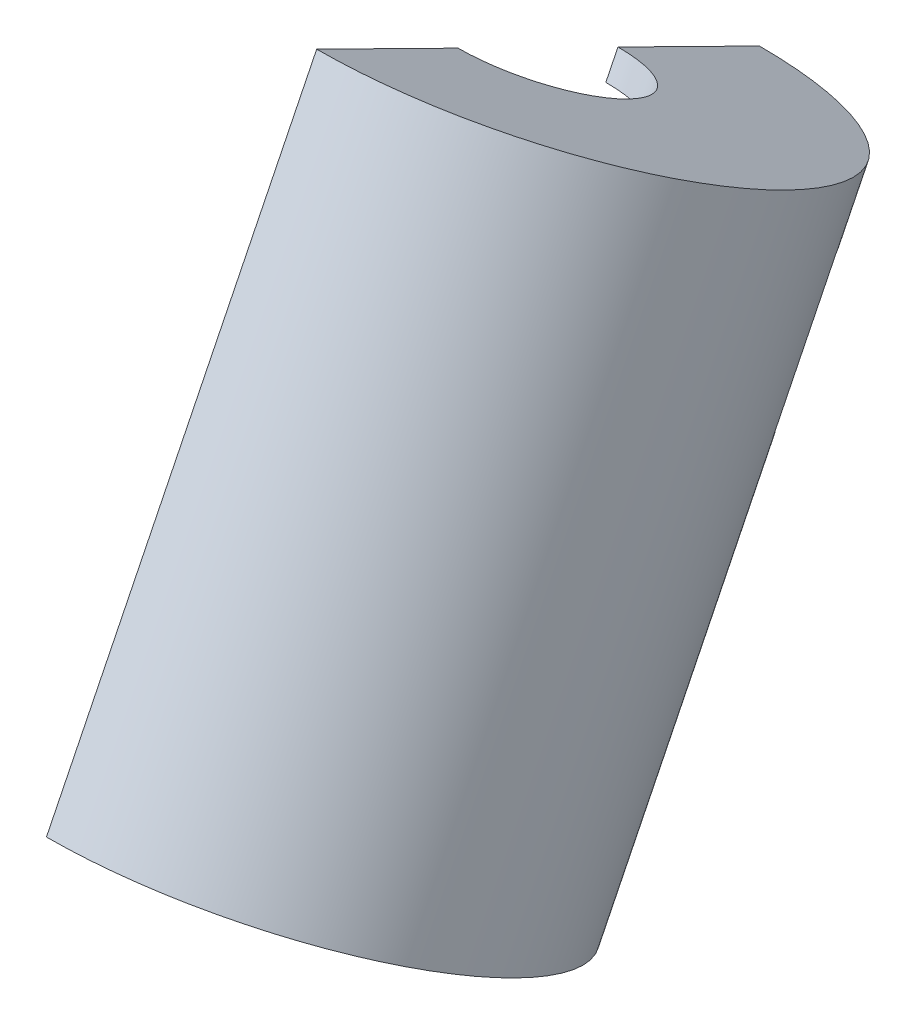
ISO-10303-21;
HEADER;
FILE_DESCRIPTION(('STEP AP214'),'2;1');
FILE_NAME('part.step','',(''),(''),'','','');
FILE_SCHEMA(('AUTOMOTIVE_DESIGN { 1 0 10303 214 1 1 1 1 }'));
ENDSEC;
DATA;
#1=APPLICATION_CONTEXT('core data for automotive mechanical design processes');
#2=APPLICATION_PROTOCOL_DEFINITION('international standard','automotive_design',2000,#1);
#3=PRODUCT_CONTEXT('',#1,'mechanical');
#4=PRODUCT('Part','Part','',(#3));
#5=PRODUCT_RELATED_PRODUCT_CATEGORY('part','',(#4));
#6=PRODUCT_DEFINITION_FORMATION('','',#4);
#7=PRODUCT_DEFINITION_CONTEXT('part definition',#1,'design');
#8=PRODUCT_DEFINITION('design','',#6,#7);
#9=PRODUCT_DEFINITION_SHAPE('','',#8);
#10=(LENGTH_UNIT() NAMED_UNIT(*) SI_UNIT(.MILLI.,.METRE.));
#11=(NAMED_UNIT(*) PLANE_ANGLE_UNIT() SI_UNIT($,.RADIAN.));
#12=(NAMED_UNIT(*) SI_UNIT($,.STERADIAN.) SOLID_ANGLE_UNIT());
#13=UNCERTAINTY_MEASURE_WITH_UNIT(LENGTH_MEASURE(1.E-05),#10,'distance_accuracy_value','');
#14=(GEOMETRIC_REPRESENTATION_CONTEXT(3) GLOBAL_UNCERTAINTY_ASSIGNED_CONTEXT((#13)) GLOBAL_UNIT_ASSIGNED_CONTEXT((#10,
#11,#12)) REPRESENTATION_CONTEXT('',''));
#15=CARTESIAN_POINT('',(0.,0.,0.));
#16=DIRECTION('',(0.,0.,1.));
#17=DIRECTION('',(1.,0.,0.));
#18=AXIS2_PLACEMENT_3D('',#15,#16,#17);
#19=CARTESIAN_POINT('',(-3.,84.7878650832363,123.186140226396));
#20=DIRECTION('',(0.,0.442780312456279,0.896630132719797));
#21=DIRECTION('',(0.,0.896630132719797,-0.442780312456279));
#22=AXIS2_PLACEMENT_3D('',#19,#20,#21);
#23=PLANE('',#22);
#24=DIRECTION('',(0.,0.896630132719797,-0.442780312456279));
#25=VECTOR('',#24,1.);
#26=CARTESIAN_POINT('',(-32.8,59.682221367082,135.583988975171));
#27=LINE('',#26,#25);
#28=CARTESIAN_POINT('',(-32.8,83.8912349505166,123.628920538852));
#29=VERTEX_POINT('',#28);
#30=CARTESIAN_POINT('',(-32.8,93.3058513440744,118.979727258061));
#31=VERTEX_POINT('',#30);
#32=EDGE_CURVE('E525',#29,#31,#27,.T.);
#33=ORIENTED_EDGE('',*,*,#32,.T.);
#34=DIRECTION('',(-1.,0.,0.));
#35=VECTOR('',#34,1.);
#36=CARTESIAN_POINT('',(-3.00000000000004,93.3058513440744,118.979727258061));
#37=LINE('',#36,#35);
#38=CARTESIAN_POINT('',(-28.0333704529043,93.3058513440744,118.979727258061));
#39=VERTEX_POINT('',#38);
#40=EDGE_CURVE('E199',#31,#39,#37,.F.);
#41=ORIENTED_EDGE('',*,*,#40,.T.);
#42=DIRECTION('',(0.,-0.896630132719797,0.442780312456279));
#43=VECTOR('',#42,1.);
#44=CARTESIAN_POINT('',(-28.0333704529043,97.7890020076734,116.76582569578));
#45=LINE('',#44,#43);
#46=CARTESIAN_POINT('',(-28.0333704529043,83.8912349505166,123.628920538852));
#47=VERTEX_POINT('',#46);
#48=EDGE_CURVE('E11',#47,#39,#45,.F.);
#49=ORIENTED_EDGE('',*,*,#48,.F.);
#50=DIRECTION('',(-1.,0.,0.));
#51=VECTOR('',#50,1.);
#52=CARTESIAN_POINT('',(-3.,83.8912349505166,123.628920538852));
#53=LINE('',#52,#51);
#54=EDGE_CURVE('E205',#29,#47,#53,.F.);
#55=ORIENTED_EDGE('',*,*,#54,.F.);
#56=EDGE_LOOP('',(#33,#41,#49,#55));
#57=FACE_BOUND('',#56,.T.);
#58=ADVANCED_FACE('F17',(#57),#23,.F.);
#59=CARTESIAN_POINT('',(-43.,59.682221367082,135.583988975171));
#60=DIRECTION('',(0.,0.442780312456279,0.896630132719797));
#61=DIRECTION('',(0.,0.896630132719797,-0.442780312456279));
#62=AXIS2_PLACEMENT_3D('',#59,#60,#61);
#63=PLANE('',#62);
#64=DIRECTION('',(1.,0.,0.));
#65=VECTOR('',#64,1.);
#66=CARTESIAN_POINT('',(-43.,95.9957417422338,117.651386320692));
#67=LINE('',#66,#65);
#68=CARTESIAN_POINT('',(-32.8,95.9957417422338,117.651386320692));
#69=VERTEX_POINT('',#68);
#70=CARTESIAN_POINT('',(-43.,95.9957417422338,117.651386320692));
#71=VERTEX_POINT('',#70);
#72=EDGE_CURVE('E160',#69,#71,#67,.F.);
#73=ORIENTED_EDGE('',*,*,#72,.T.);
#74=DIRECTION('',(0.,0.896630132719797,-0.442780312456279));
#75=VECTOR('',#74,1.);
#76=CARTESIAN_POINT('',(-43.,59.682221367082,135.583988975171));
#77=LINE('',#76,#75);
#78=CARTESIAN_POINT('',(-43.,93.3058513440744,118.979727258061));
#79=VERTEX_POINT('',#78);
#80=EDGE_CURVE('E261',#79,#71,#77,.T.);
#81=ORIENTED_EDGE('',*,*,#80,.F.);
#82=DIRECTION('',(-1.,0.,0.));
#83=VECTOR('',#82,1.);
#84=CARTESIAN_POINT('',(-3.00000000000004,93.3058513440744,118.979727258061));
#85=LINE('',#84,#83);
#86=EDGE_CURVE('E203',#31,#79,#85,.T.);
#87=ORIENTED_EDGE('',*,*,#86,.F.);
#88=EDGE_CURVE('E147',#31,#69,#27,.T.);
#89=ORIENTED_EDGE('',*,*,#88,.T.);
#90=EDGE_LOOP('',(#73,#81,#87,#89));
#91=FACE_BOUND('',#90,.T.);
#92=ADVANCED_FACE('F329',(#91),#63,.T.);
#93=CARTESIAN_POINT('',(-43.,94.2467595080232,109.592784634021));
#94=DIRECTION('',(-1.,0.,0.));
#95=DIRECTION('',(0.,-0.794020340645652,-0.607891189803704));
#96=AXIS2_PLACEMENT_3D('',#93,#94,#95);
#97=PLANE('',#96);
#98=DIRECTION('',(0.,-0.896630132719797,0.442780312456279));
#99=VECTOR('',#98,1.);
#100=CARTESIAN_POINT('',(-43.,127.510630481197,120.490715074249));
#101=LINE('',#100,#99);
#102=CARTESIAN_POINT('',(-43.,105.094877163202,131.560222885656));
#103=VERTEX_POINT('',#102);
#104=CARTESIAN_POINT('',(-43.,103.301616897762,132.445783510569));
#105=VERTEX_POINT('',#104);
#106=EDGE_CURVE('E244',#103,#105,#101,.T.);
#107=ORIENTED_EDGE('',*,*,#106,.T.);
#108=DIRECTION('',(0.,0.44278031245628,0.896630132719796));
#109=VECTOR('',#108,1.);
#110=CARTESIAN_POINT('',(-43.,95.9957417422338,117.651386320692));
#111=LINE('',#110,#109);
#112=CARTESIAN_POINT('',(-43.,104.851347991359,135.583988975088));
#113=VERTEX_POINT('',#112);
#114=EDGE_CURVE('E266',#105,#113,#111,.T.);
#115=ORIENTED_EDGE('',*,*,#114,.T.);
#116=DIRECTION('',(0.,-0.896630132719797,0.442780312456279));
#117=VECTOR('',#116,1.);
#118=CARTESIAN_POINT('',(-43.,104.851347991359,135.583988975088));
#119=LINE('',#118,#117);
#120=CARTESIAN_POINT('',(-43.,68.5378276162076,153.516591629568));
#121=VERTEX_POINT('',#120);
#122=EDGE_CURVE('E154',#113,#121,#119,.T.);
#123=ORIENTED_EDGE('',*,*,#122,.T.);
#124=DIRECTION('',(0.,-0.44278031245628,-0.896630132719796));
#125=VECTOR('',#124,1.);
#126=CARTESIAN_POINT('',(-43.,68.5378276162076,153.516591629568));
#127=LINE('',#126,#125);
#128=CARTESIAN_POINT('',(-43.,66.9880965226106,150.378386165048));
#129=VERTEX_POINT('',#128);
#130=EDGE_CURVE('E151',#121,#129,#127,.T.);
#131=ORIENTED_EDGE('',*,*,#130,.T.);
#132=CARTESIAN_POINT('',(-43.,65.1948362571711,151.263946789961));
#133=VERTEX_POINT('',#132);
#134=EDGE_CURVE('E250',#129,#133,#101,.T.);
#135=ORIENTED_EDGE('',*,*,#134,.T.);
#136=DIRECTION('',(0.,0.44278031245628,0.896630132719796));
#137=VECTOR('',#136,1.);
#138=CARTESIAN_POINT('',(-43.,54.3467186019922,129.296508538326));
#139=LINE('',#138,#137);
#140=CARTESIAN_POINT('',(-43.,70.2868098504183,161.575193316239));
#141=VERTEX_POINT('',#140);
#142=EDGE_CURVE('E181',#133,#141,#139,.T.);
#143=ORIENTED_EDGE('',*,*,#142,.T.);
#144=DIRECTION('',(0.,-0.896630132719797,0.442780312456279));
#145=VECTOR('',#144,1.);
#146=CARTESIAN_POINT('',(-43.,110.186850756449,141.871469411934));
#147=LINE('',#146,#145);
#148=CARTESIAN_POINT('',(-43.,110.186850756449,141.871469411934));
#149=VERTEX_POINT('',#148);
#150=EDGE_CURVE('E189',#149,#141,#147,.T.);
#151=ORIENTED_EDGE('',*,*,#150,.F.);
#152=DIRECTION('',(0.,0.44278031245628,0.896630132719796));
#153=VECTOR('',#152,1.);
#154=CARTESIAN_POINT('',(-43.,102.216805132236,125.732127022978));
#155=LINE('',#154,#153);
#156=EDGE_CURVE('E174',#103,#149,#155,.T.);
#157=ORIENTED_EDGE('',*,*,#156,.F.);
#158=EDGE_LOOP('',(#107,#115,#123,#131,#135,#143,#151,#157));
#159=FACE_BOUND('',#158,.T.);
#160=ADVANCED_FACE('F324',(#159),#97,.T.);
#161=DIRECTION('',(0.,0.442780312456276,0.896630132719798));
#162=VECTOR('',#161,1.);
#163=CARTESIAN_POINT('',(-43.,91.091949781793,114.496576594462));
#164=LINE('',#163,#162);
#165=CARTESIAN_POINT('',(-43.,91.091949781793,114.496576594462));
#166=VERTEX_POINT('',#165);
#167=EDGE_CURVE('E204',#166,#79,#164,.T.);
#168=ORIENTED_EDGE('',*,*,#167,.T.);
#169=ORIENTED_EDGE('',*,*,#80,.T.);
#170=CARTESIAN_POINT('',(-43.,97.5454728358308,120.789591785211));
#171=VERTEX_POINT('',#170);
#172=EDGE_CURVE('E163',#71,#171,#111,.T.);
#173=ORIENTED_EDGE('',*,*,#172,.T.);
#174=DIRECTION('',(0.,-0.896630132719797,0.442780312456279));
#175=VECTOR('',#174,1.);
#176=CARTESIAN_POINT('',(-43.,121.754486419265,108.834523348892));
#177=LINE('',#176,#175);
#178=CARTESIAN_POINT('',(-43.,99.3387331012704,119.904031160299));
#179=VERTEX_POINT('',#178);
#180=EDGE_CURVE('E240',#171,#179,#177,.F.);
#181=ORIENTED_EDGE('',*,*,#180,.T.);
#182=CARTESIAN_POINT('',(-43.,94.2467595080232,109.592784634021));
#183=VERTEX_POINT('',#182);
#184=EDGE_CURVE('E169',#183,#179,#155,.T.);
#185=ORIENTED_EDGE('',*,*,#184,.F.);
#186=DIRECTION('',(0.,-0.896630132719797,0.442780312456279));
#187=VECTOR('',#186,1.);
#188=CARTESIAN_POINT('',(-43.,94.2467595080232,109.592784634021));
#189=LINE('',#188,#187);
#190=CARTESIAN_POINT('',(-43.,54.3467186019922,129.296508538326));
#191=VERTEX_POINT('',#190);
#192=EDGE_CURVE('E177',#191,#183,#189,.F.);
#193=ORIENTED_EDGE('',*,*,#192,.F.);
#194=CARTESIAN_POINT('',(-43.,59.4386921952394,139.607755064603));
#195=VERTEX_POINT('',#194);
#196=EDGE_CURVE('E182',#191,#195,#139,.T.);
#197=ORIENTED_EDGE('',*,*,#196,.T.);
#198=CARTESIAN_POINT('',(-43.,61.231952460679,138.722194439691));
#199=VERTEX_POINT('',#198);
#200=EDGE_CURVE('E245',#195,#199,#177,.F.);
#201=ORIENTED_EDGE('',*,*,#200,.T.);
#202=CARTESIAN_POINT('',(-43.,59.682221367082,135.583988975171));
#203=VERTEX_POINT('',#202);
#204=EDGE_CURVE('E258',#199,#203,#127,.T.);
#205=ORIENTED_EDGE('',*,*,#204,.T.);
#206=CARTESIAN_POINT('',(-43.,83.8912349505166,123.628920538852));
#207=VERTEX_POINT('',#206);
#208=EDGE_CURVE('E262',#203,#207,#77,.T.);
#209=ORIENTED_EDGE('',*,*,#208,.T.);
#210=DIRECTION('',(0.,-0.442780312456278,-0.896630132719797));
#211=VECTOR('',#210,1.);
#212=CARTESIAN_POINT('',(-43.,83.8912349505166,123.628920538852));
#213=LINE('',#212,#211);
#214=CARTESIAN_POINT('',(-43.,81.6773333882351,119.145769875253));
#215=VERTEX_POINT('',#214);
#216=EDGE_CURVE('E138',#207,#215,#213,.T.);
#217=ORIENTED_EDGE('',*,*,#216,.T.);
#218=DIRECTION('',(0.,0.896630132719797,-0.442780312456278));
#219=VECTOR('',#218,1.);
#220=CARTESIAN_POINT('',(-43.,81.6773333882351,119.145769875253));
#221=LINE('',#220,#219);
#222=EDGE_CURVE('E534',#215,#166,#221,.T.);
#223=ORIENTED_EDGE('',*,*,#222,.T.);
#224=EDGE_LOOP('',(#168,#169,#173,#181,#185,#193,#197,#201,#205,#209,#217,#223));
#225=FACE_BOUND('',#224,.T.);
#226=ADVANCED_FACE('F284',(#225),#97,.T.);
#227=CARTESIAN_POINT('',(-43.,102.216805132236,125.732127022978));
#228=DIRECTION('',(0.,-0.896630132719797,0.442780312456279));
#229=DIRECTION('',(0.,0.442780312456279,0.896630132719797));
#230=AXIS2_PLACEMENT_3D('',#227,#228,#229);
#231=CYLINDRICAL_SURFACE('',#230,18.);
#232=ORIENTED_EDGE('',*,*,#48,.T.);
#233=CARTESIAN_POINT('',(-43.,97.7336544686372,127.946028585259));
#234=DIRECTION('',(0.,-0.896630132719798,0.442780312456276));
#235=DIRECTION('',(0.,-0.442780312456276,-0.896630132719798));
#236=AXIS2_PLACEMENT_3D('',#233,#234,#235);
#237=CIRCLE('',#236,18.);
#238=CARTESIAN_POINT('',(-33.0501256289338,91.091949781793,114.496576594462));
#239=VERTEX_POINT('',#238);
#240=EDGE_CURVE('E209',#39,#239,#237,.F.);
#241=ORIENTED_EDGE('',*,*,#240,.T.);
#242=DIRECTION('',(0.,-0.896630132719797,0.442780312456279));
#243=VECTOR('',#242,1.);
#244=CARTESIAN_POINT('',(-33.0501256289338,95.575100445392,112.282675032181));
#245=LINE('',#244,#243);
#246=CARTESIAN_POINT('',(-33.0501256289338,81.6773333882351,119.145769875253));
#247=VERTEX_POINT('',#246);
#248=EDGE_CURVE('E27',#239,#247,#245,.T.);
#249=ORIENTED_EDGE('',*,*,#248,.T.);
#250=CARTESIAN_POINT('',(-43.,88.3190380750793,132.59522186605));
#251=DIRECTION('',(0.,0.896630132719797,-0.442780312456278));
#252=DIRECTION('',(0.,0.442780312456278,0.896630132719797));
#253=AXIS2_PLACEMENT_3D('',#250,#251,#252);
#254=CIRCLE('',#253,18.);
#255=EDGE_CURVE('E237',#247,#47,#254,.F.);
#256=ORIENTED_EDGE('',*,*,#255,.T.);
#257=EDGE_LOOP('',(#232,#241,#249,#256));
#258=FACE_BOUND('',#257,.T.);
#259=CARTESIAN_POINT('',(-43.,62.3167642262053,145.435850927282));
#260=DIRECTION('',(0.,0.896630132719797,-0.442780312456278));
#261=DIRECTION('',(1.,0.,0.));
#262=AXIS2_PLACEMENT_3D('',#259,#260,#261);
#263=CIRCLE('',#262,18.);
#264=EDGE_CURVE('E178',#141,#191,#263,.T.);
#265=ORIENTED_EDGE('',*,*,#264,.T.);
#266=ORIENTED_EDGE('',*,*,#192,.T.);
#267=CARTESIAN_POINT('',(-43.,102.216805132236,125.732127022978));
#268=DIRECTION('',(0.,0.896630132719797,-0.442780312456278));
#269=DIRECTION('',(1.,0.,0.));
#270=AXIS2_PLACEMENT_3D('',#267,#268,#269);
#271=CIRCLE('',#270,18.);
#272=EDGE_CURVE('E173',#149,#183,#271,.T.);
#273=ORIENTED_EDGE('',*,*,#272,.F.);
#274=ORIENTED_EDGE('',*,*,#150,.T.);
#275=EDGE_LOOP('',(#265,#266,#273,#274));
#276=FACE_BOUND('',#275,.T.);
#277=ADVANCED_FACE('F19',(#258,#276),#231,.T.);
#278=CARTESIAN_POINT('',(-43.,102.216805132236,125.732127022978));
#279=DIRECTION('',(0.,-0.896630132719797,0.442780312456278));
#280=DIRECTION('',(0.,0.442780312456278,0.896630132719797));
#281=AXIS2_PLACEMENT_3D('',#278,#279,#280);
#282=PLANE('',#281);
#283=ORIENTED_EDGE('',*,*,#156,.T.);
#284=ORIENTED_EDGE('',*,*,#272,.T.);
#285=ORIENTED_EDGE('',*,*,#184,.T.);
#286=CARTESIAN_POINT('',(-43.,102.216805132236,125.732127022978));
#287=DIRECTION('',(0.,0.896630132719797,-0.442780312456278));
#288=DIRECTION('',(0.,0.442780312456278,0.896630132719797));
#289=AXIS2_PLACEMENT_3D('',#286,#287,#288);
#290=CIRCLE('',#289,6.5);
#291=EDGE_CURVE('E249',#103,#179,#290,.T.);
#292=ORIENTED_EDGE('',*,*,#291,.F.);
#293=EDGE_LOOP('',(#283,#284,#285,#292));
#294=FACE_BOUND('',#293,.T.);
#295=ADVANCED_FACE('F303',(#294),#282,.F.);
#296=CARTESIAN_POINT('',(-43.,62.3167642262053,145.435850927282));
#297=DIRECTION('',(0.,-0.896630132719797,0.442780312456278));
#298=DIRECTION('',(0.,0.442780312456278,0.896630132719797));
#299=AXIS2_PLACEMENT_3D('',#296,#297,#298);
#300=PLANE('',#299);
#301=CARTESIAN_POINT('',(-43.,62.3167642262052,145.435850927282));
#302=DIRECTION('',(0.,0.896630132719797,-0.442780312456278));
#303=DIRECTION('',(0.,0.442780312456278,0.896630132719797));
#304=AXIS2_PLACEMENT_3D('',#301,#302,#303);
#305=CIRCLE('',#304,6.5);
#306=EDGE_CURVE('E256',#133,#195,#305,.T.);
#307=ORIENTED_EDGE('',*,*,#306,.T.);
#308=ORIENTED_EDGE('',*,*,#196,.F.);
#309=ORIENTED_EDGE('',*,*,#264,.F.);
#310=ORIENTED_EDGE('',*,*,#142,.F.);
#311=EDGE_LOOP('',(#307,#308,#309,#310));
#312=FACE_BOUND('',#311,.T.);
#313=ADVANCED_FACE('F296',(#312),#300,.T.);
#314=CARTESIAN_POINT('',(-43.,68.5378276162076,153.516591629568));
#315=DIRECTION('',(0.,0.896630132719796,-0.44278031245628));
#316=DIRECTION('',(0.,-0.44278031245628,-0.896630132719796));
#317=AXIS2_PLACEMENT_3D('',#314,#315,#316);
#318=PLANE('',#317);
#319=CARTESIAN_POINT('',(-43.,64.1100244916448,144.550290302369));
#320=DIRECTION('',(0.,-0.896630132719796,0.44278031245628));
#321=DIRECTION('',(0.,-0.44278031245628,-0.896630132719796));
#322=AXIS2_PLACEMENT_3D('',#319,#320,#321);
#323=CIRCLE('',#322,6.5);
#324=EDGE_CURVE('E253',#199,#129,#323,.T.);
#325=ORIENTED_EDGE('',*,*,#324,.T.);
#326=ORIENTED_EDGE('',*,*,#130,.F.);
#327=DIRECTION('',(1.,0.,0.));
#328=VECTOR('',#327,1.);
#329=CARTESIAN_POINT('',(-43.,68.5378276162076,153.516591629568));
#330=LINE('',#329,#328);
#331=CARTESIAN_POINT('',(-32.8,68.5378276162076,153.516591629568));
#332=VERTEX_POINT('',#331);
#333=EDGE_CURVE('E132',#332,#121,#330,.F.);
#334=ORIENTED_EDGE('',*,*,#333,.F.);
#335=DIRECTION('',(0.,-0.44278031245628,-0.896630132719796));
#336=VECTOR('',#335,1.);
#337=CARTESIAN_POINT('',(-32.8,68.5378276162076,153.516591629568));
#338=LINE('',#337,#336);
#339=CARTESIAN_POINT('',(-32.8,59.682221367082,135.583988975171));
#340=VERTEX_POINT('',#339);
#341=EDGE_CURVE('E142',#332,#340,#338,.T.);
#342=ORIENTED_EDGE('',*,*,#341,.T.);
#343=DIRECTION('',(1.,0.,0.));
#344=VECTOR('',#343,1.);
#345=CARTESIAN_POINT('',(-43.,59.682221367082,135.583988975171));
#346=LINE('',#345,#344);
#347=EDGE_CURVE('E167',#340,#203,#346,.F.);
#348=ORIENTED_EDGE('',*,*,#347,.T.);
#349=ORIENTED_EDGE('',*,*,#204,.F.);
#350=EDGE_LOOP('',(#325,#326,#334,#342,#348,#349));
#351=FACE_BOUND('',#350,.T.);
#352=ADVANCED_FACE('F149',(#351),#318,.T.);
#353=DIRECTION('',(-1.,0.,0.));
#354=VECTOR('',#353,1.);
#355=CARTESIAN_POINT('',(-3.,83.8912349505166,123.628920538852));
#356=LINE('',#355,#354);
#357=EDGE_CURVE('E210',#29,#207,#356,.T.);
#358=ORIENTED_EDGE('',*,*,#357,.T.);
#359=ORIENTED_EDGE('',*,*,#208,.F.);
#360=ORIENTED_EDGE('',*,*,#347,.F.);
#361=EDGE_CURVE('E35',#340,#29,#27,.T.);
#362=ORIENTED_EDGE('',*,*,#361,.T.);
#363=EDGE_LOOP('',(#358,#359,#360,#362));
#364=FACE_BOUND('',#363,.T.);
#365=ADVANCED_FACE('F281',(#364),#63,.T.);
#366=CARTESIAN_POINT('',(-43.,95.9957417422338,117.651386320692));
#367=DIRECTION('',(0.,-0.896630132719796,0.44278031245628));
#368=DIRECTION('',(0.,0.44278031245628,0.896630132719796));
#369=AXIS2_PLACEMENT_3D('',#366,#367,#368);
#370=PLANE('',#369);
#371=CARTESIAN_POINT('',(-43.,100.423544866797,126.61768764789));
#372=DIRECTION('',(0.,0.896630132719796,-0.44278031245628));
#373=DIRECTION('',(0.,0.44278031245628,0.896630132719796));
#374=AXIS2_PLACEMENT_3D('',#371,#372,#373);
#375=CIRCLE('',#374,6.5);
#376=EDGE_CURVE('E193',#105,#171,#375,.T.);
#377=ORIENTED_EDGE('',*,*,#376,.T.);
#378=ORIENTED_EDGE('',*,*,#172,.F.);
#379=ORIENTED_EDGE('',*,*,#72,.F.);
#380=DIRECTION('',(0.,0.44278031245628,0.896630132719796));
#381=VECTOR('',#380,1.);
#382=CARTESIAN_POINT('',(-32.8,95.9957417422338,117.651386320692));
#383=LINE('',#382,#381);
#384=CARTESIAN_POINT('',(-32.8,104.851347991359,135.583988975088));
#385=VERTEX_POINT('',#384);
#386=EDGE_CURVE('E139',#69,#385,#383,.T.);
#387=ORIENTED_EDGE('',*,*,#386,.T.);
#388=DIRECTION('',(1.,0.,0.));
#389=VECTOR('',#388,1.);
#390=CARTESIAN_POINT('',(-43.,104.851347991359,135.583988975088));
#391=LINE('',#390,#389);
#392=EDGE_CURVE('E134',#385,#113,#391,.F.);
#393=ORIENTED_EDGE('',*,*,#392,.T.);
#394=ORIENTED_EDGE('',*,*,#114,.F.);
#395=EDGE_LOOP('',(#377,#378,#379,#387,#393,#394));
#396=FACE_BOUND('',#395,.T.);
#397=ADVANCED_FACE('F338',(#396),#370,.T.);
#398=CARTESIAN_POINT('',(-43.,104.851347991359,135.583988975088));
#399=DIRECTION('',(0.,-0.442780312456279,-0.896630132719797));
#400=DIRECTION('',(0.,-0.896630132719797,0.442780312456279));
#401=AXIS2_PLACEMENT_3D('',#398,#399,#400);
#402=PLANE('',#401);
#403=ORIENTED_EDGE('',*,*,#333,.T.);
#404=ORIENTED_EDGE('',*,*,#122,.F.);
#405=ORIENTED_EDGE('',*,*,#392,.F.);
#406=DIRECTION('',(0.,-0.896630132719797,0.442780312456279));
#407=VECTOR('',#406,1.);
#408=CARTESIAN_POINT('',(-32.8,104.851347991359,135.583988975088));
#409=LINE('',#408,#407);
#410=EDGE_CURVE('E127',#385,#332,#409,.T.);
#411=ORIENTED_EDGE('',*,*,#410,.T.);
#412=EDGE_LOOP('',(#403,#404,#405,#411));
#413=FACE_BOUND('',#412,.T.);
#414=ADVANCED_FACE('F129',(#413),#402,.T.);
#415=CARTESIAN_POINT('',(-43.,124.632558450231,114.662619211571));
#416=DIRECTION('',(0.,-0.896630132719797,0.442780312456279));
#417=DIRECTION('',(0.,0.442780312456279,0.896630132719797));
#418=AXIS2_PLACEMENT_3D('',#415,#416,#417);
#419=CYLINDRICAL_SURFACE('',#418,6.5);
#420=ORIENTED_EDGE('',*,*,#106,.F.);
#421=ORIENTED_EDGE('',*,*,#291,.T.);
#422=ORIENTED_EDGE('',*,*,#180,.F.);
#423=ORIENTED_EDGE('',*,*,#376,.F.);
#424=EDGE_LOOP('',(#420,#421,#422,#423));
#425=FACE_BOUND('',#424,.T.);
#426=ADVANCED_FACE('F368',(#425),#419,.F.);
#427=ORIENTED_EDGE('',*,*,#306,.F.);
#428=ORIENTED_EDGE('',*,*,#134,.F.);
#429=ORIENTED_EDGE('',*,*,#324,.F.);
#430=ORIENTED_EDGE('',*,*,#200,.F.);
#431=EDGE_LOOP('',(#427,#428,#429,#430));
#432=FACE_BOUND('',#431,.T.);
#433=ADVANCED_FACE('F386',(#432),#419,.F.);
#434=CARTESIAN_POINT('',(-3.,83.8912349505166,123.628920538852));
#435=DIRECTION('',(0.,-0.896630132719797,0.442780312456278));
#436=DIRECTION('',(0.,0.442780312456278,0.896630132719797));
#437=AXIS2_PLACEMENT_3D('',#434,#435,#436);
#438=PLANE('',#437);
#439=ORIENTED_EDGE('',*,*,#255,.F.);
#440=DIRECTION('',(-1.,0.,0.));
#441=VECTOR('',#440,1.);
#442=CARTESIAN_POINT('',(-3.,81.6773333882351,119.145769875253));
#443=LINE('',#442,#441);
#444=EDGE_CURVE('E43',#215,#247,#443,.F.);
#445=ORIENTED_EDGE('',*,*,#444,.F.);
#446=ORIENTED_EDGE('',*,*,#216,.F.);
#447=ORIENTED_EDGE('',*,*,#357,.F.);
#448=ORIENTED_EDGE('',*,*,#54,.T.);
#449=EDGE_LOOP('',(#439,#445,#446,#447,#448));
#450=FACE_BOUND('',#449,.T.);
#451=ADVANCED_FACE('F408',(#450),#438,.F.);
#452=CARTESIAN_POINT('',(-3.,81.6773333882351,119.145769875253));
#453=DIRECTION('',(0.,-0.442780312456278,-0.896630132719797));
#454=DIRECTION('',(0.,-0.896630132719797,0.442780312456278));
#455=AXIS2_PLACEMENT_3D('',#452,#453,#454);
#456=PLANE('',#455);
#457=ORIENTED_EDGE('',*,*,#248,.F.);
#458=DIRECTION('',(-1.,0.,0.));
#459=VECTOR('',#458,1.);
#460=CARTESIAN_POINT('',(-3.,91.091949781793,114.496576594462));
#461=LINE('',#460,#459);
#462=EDGE_CURVE('E216',#166,#239,#461,.F.);
#463=ORIENTED_EDGE('',*,*,#462,.F.);
#464=ORIENTED_EDGE('',*,*,#222,.F.);
#465=ORIENTED_EDGE('',*,*,#444,.T.);
#466=EDGE_LOOP('',(#457,#463,#464,#465));
#467=FACE_BOUND('',#466,.T.);
#468=ADVANCED_FACE('F318',(#467),#456,.F.);
#469=CARTESIAN_POINT('',(-3.,91.091949781793,114.496576594462));
#470=DIRECTION('',(0.,0.896630132719798,-0.442780312456276));
#471=DIRECTION('',(0.,-0.442780312456276,-0.896630132719798));
#472=AXIS2_PLACEMENT_3D('',#469,#470,#471);
#473=PLANE('',#472);
#474=ORIENTED_EDGE('',*,*,#240,.F.);
#475=ORIENTED_EDGE('',*,*,#40,.F.);
#476=ORIENTED_EDGE('',*,*,#86,.T.);
#477=ORIENTED_EDGE('',*,*,#167,.F.);
#478=ORIENTED_EDGE('',*,*,#462,.T.);
#479=EDGE_LOOP('',(#474,#475,#476,#477,#478));
#480=FACE_BOUND('',#479,.T.);
#481=ADVANCED_FACE('F313',(#480),#473,.F.);
#482=CARTESIAN_POINT('',(-32.8,77.8971914921522,157.741812771242));
#483=DIRECTION('',(-1.,0.,0.));
#484=DIRECTION('',(0.,-0.794020340645652,-0.607891189803704));
#485=AXIS2_PLACEMENT_3D('',#482,#483,#484);
#486=PLANE('',#485);
#487=ORIENTED_EDGE('',*,*,#341,.F.);
#488=ORIENTED_EDGE('',*,*,#410,.F.);
#489=ORIENTED_EDGE('',*,*,#386,.F.);
#490=ORIENTED_EDGE('',*,*,#88,.F.);
#491=ORIENTED_EDGE('',*,*,#32,.F.);
#492=ORIENTED_EDGE('',*,*,#361,.F.);
#493=EDGE_LOOP('',(#487,#488,#489,#490,#491,#492));
#494=FACE_BOUND('',#493,.T.);
#495=ADVANCED_FACE('F143',(#494),#486,.T.);
#496=CLOSED_SHELL('',(#58,#92,#160,#226,#277,#295,#313,#352,#365,#397,#414,#426,#433,#451,#468,
#481,#495));
#497=MANIFOLD_SOLID_BREP('B1',#496);
#498=ADVANCED_BREP_SHAPE_REPRESENTATION('',(#18,#497),#14);
#499=SHAPE_DEFINITION_REPRESENTATION(#9,#498);
ENDSEC;
END-ISO-10303-21;
